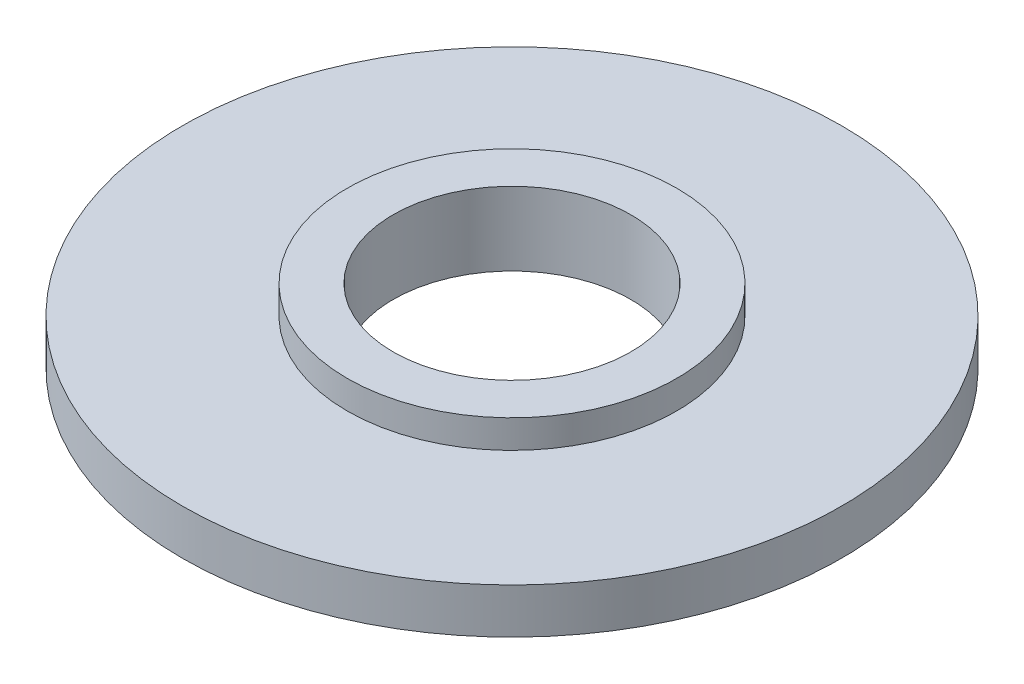
ISO-10303-21;
HEADER;
FILE_DESCRIPTION(('STEP AP214'),'2;1');
FILE_NAME('part.step','',(''),(''),'','','');
FILE_SCHEMA(('AUTOMOTIVE_DESIGN { 1 0 10303 214 1 1 1 1 }'));
ENDSEC;
DATA;
#1=APPLICATION_CONTEXT('core data for automotive mechanical design processes');
#2=APPLICATION_PROTOCOL_DEFINITION('international standard','automotive_design',2000,#1);
#3=PRODUCT_CONTEXT('',#1,'mechanical');
#4=PRODUCT('Part','Part','',(#3));
#5=PRODUCT_RELATED_PRODUCT_CATEGORY('part','',(#4));
#6=PRODUCT_DEFINITION_FORMATION('','',#4);
#7=PRODUCT_DEFINITION_CONTEXT('part definition',#1,'design');
#8=PRODUCT_DEFINITION('design','',#6,#7);
#9=PRODUCT_DEFINITION_SHAPE('','',#8);
#10=(LENGTH_UNIT() NAMED_UNIT(*) SI_UNIT(.MILLI.,.METRE.));
#11=(NAMED_UNIT(*) PLANE_ANGLE_UNIT() SI_UNIT($,.RADIAN.));
#12=(NAMED_UNIT(*) SI_UNIT($,.STERADIAN.) SOLID_ANGLE_UNIT());
#13=UNCERTAINTY_MEASURE_WITH_UNIT(LENGTH_MEASURE(1.E-05),#10,'distance_accuracy_value','');
#14=(GEOMETRIC_REPRESENTATION_CONTEXT(3) GLOBAL_UNCERTAINTY_ASSIGNED_CONTEXT((#13)) GLOBAL_UNIT_ASSIGNED_CONTEXT((#10,
#11,#12)) REPRESENTATION_CONTEXT('',''));
#15=CARTESIAN_POINT('',(0.,0.,0.));
#16=DIRECTION('',(0.,0.,1.));
#17=DIRECTION('',(1.,0.,0.));
#18=AXIS2_PLACEMENT_3D('',#15,#16,#17);
#19=CARTESIAN_POINT('',(0.,1.92,0.));
#20=DIRECTION('',(0.,1.,0.));
#21=DIRECTION('',(0.,0.,1.));
#22=AXIS2_PLACEMENT_3D('',#19,#20,#21);
#23=PLANE('',#22);
#24=CARTESIAN_POINT('',(0.,1.92,0.));
#25=DIRECTION('',(0.,1.,0.));
#26=DIRECTION('',(0.,0.,1.));
#27=AXIS2_PLACEMENT_3D('',#24,#25,#26);
#28=CIRCLE('',#27,14.);
#29=CARTESIAN_POINT('',(0.,1.92,14.));
#30=VERTEX_POINT('',#29);
#31=EDGE_CURVE('E10',#30,#30,#28,.T.);
#32=ORIENTED_EDGE('',*,*,#31,.T.);
#33=EDGE_LOOP('',(#32));
#34=FACE_BOUND('',#33,.T.);
#35=CARTESIAN_POINT('',(0.,1.92,0.));
#36=DIRECTION('',(0.,1.,0.));
#37=DIRECTION('',(0.,0.,1.));
#38=AXIS2_PLACEMENT_3D('',#35,#36,#37);
#39=CIRCLE('',#38,7.);
#40=CARTESIAN_POINT('',(0.,1.92,7.));
#41=VERTEX_POINT('',#40);
#42=EDGE_CURVE('E57',#41,#41,#39,.T.);
#43=ORIENTED_EDGE('',*,*,#42,.F.);
#44=EDGE_LOOP('',(#43));
#45=FACE_BOUND('',#44,.T.);
#46=ADVANCED_FACE('F41',(#34,#45),#23,.T.);
#47=CARTESIAN_POINT('',(0.,0.,0.));
#48=DIRECTION('',(0.,1.,0.));
#49=DIRECTION('',(0.,0.,1.));
#50=AXIS2_PLACEMENT_3D('',#47,#48,#49);
#51=PLANE('',#50);
#52=CARTESIAN_POINT('',(0.,0.,0.));
#53=DIRECTION('',(0.,1.,0.));
#54=DIRECTION('',(0.,0.,1.));
#55=AXIS2_PLACEMENT_3D('',#52,#53,#54);
#56=CIRCLE('',#55,14.);
#57=CARTESIAN_POINT('',(0.,0.,14.));
#58=VERTEX_POINT('',#57);
#59=EDGE_CURVE('E45',#58,#58,#56,.T.);
#60=ORIENTED_EDGE('',*,*,#59,.F.);
#61=EDGE_LOOP('',(#60));
#62=FACE_BOUND('',#61,.T.);
#63=CARTESIAN_POINT('',(0.,0.,0.));
#64=DIRECTION('',(0.,1.,0.));
#65=DIRECTION('',(0.,0.,1.));
#66=AXIS2_PLACEMENT_3D('',#63,#64,#65);
#67=CIRCLE('',#66,5.05);
#68=CARTESIAN_POINT('',(0.,0.,5.05));
#69=VERTEX_POINT('',#68);
#70=EDGE_CURVE('E52',#69,#69,#67,.T.);
#71=ORIENTED_EDGE('',*,*,#70,.T.);
#72=EDGE_LOOP('',(#71));
#73=FACE_BOUND('',#72,.T.);
#74=ADVANCED_FACE('F82',(#62,#73),#51,.F.);
#75=CARTESIAN_POINT('',(0.,1.92,0.));
#76=DIRECTION('',(0.,-1.,0.));
#77=DIRECTION('',(0.,0.,-1.));
#78=AXIS2_PLACEMENT_3D('',#75,#76,#77);
#79=CYLINDRICAL_SURFACE('',#78,14.);
#80=ORIENTED_EDGE('',*,*,#31,.F.);
#81=EDGE_LOOP('',(#80));
#82=FACE_BOUND('',#81,.T.);
#83=ORIENTED_EDGE('',*,*,#59,.T.);
#84=EDGE_LOOP('',(#83));
#85=FACE_BOUND('',#84,.T.);
#86=ADVANCED_FACE('F43',(#82,#85),#79,.T.);
#87=CARTESIAN_POINT('',(0.,1.92,0.));
#88=DIRECTION('',(0.,-1.,0.));
#89=DIRECTION('',(0.,0.,-1.));
#90=AXIS2_PLACEMENT_3D('',#87,#88,#89);
#91=CYLINDRICAL_SURFACE('',#90,5.05);
#92=ORIENTED_EDGE('',*,*,#70,.F.);
#93=EDGE_LOOP('',(#92));
#94=FACE_BOUND('',#93,.T.);
#95=CARTESIAN_POINT('',(0.,3.12,0.));
#96=DIRECTION('',(0.,1.,0.));
#97=DIRECTION('',(0.,0.,1.));
#98=AXIS2_PLACEMENT_3D('',#95,#96,#97);
#99=CIRCLE('',#98,5.05);
#100=CARTESIAN_POINT('',(0.,3.12,5.05));
#101=VERTEX_POINT('',#100);
#102=EDGE_CURVE('E60',#101,#101,#99,.T.);
#103=ORIENTED_EDGE('',*,*,#102,.T.);
#104=EDGE_LOOP('',(#103));
#105=FACE_BOUND('',#104,.T.);
#106=ADVANCED_FACE('F66',(#94,#105),#91,.F.);
#107=CARTESIAN_POINT('',(0.,3.12,0.));
#108=DIRECTION('',(0.,1.,0.));
#109=DIRECTION('',(0.,0.,1.));
#110=AXIS2_PLACEMENT_3D('',#107,#108,#109);
#111=PLANE('',#110);
#112=CARTESIAN_POINT('',(0.,3.12,0.));
#113=DIRECTION('',(0.,1.,0.));
#114=DIRECTION('',(0.,0.,1.));
#115=AXIS2_PLACEMENT_3D('',#112,#113,#114);
#116=CIRCLE('',#115,7.);
#117=CARTESIAN_POINT('',(0.,3.12,7.));
#118=VERTEX_POINT('',#117);
#119=EDGE_CURVE('E56',#118,#118,#116,.T.);
#120=ORIENTED_EDGE('',*,*,#119,.T.);
#121=EDGE_LOOP('',(#120));
#122=FACE_BOUND('',#121,.T.);
#123=ORIENTED_EDGE('',*,*,#102,.F.);
#124=EDGE_LOOP('',(#123));
#125=FACE_BOUND('',#124,.T.);
#126=ADVANCED_FACE('F68',(#122,#125),#111,.T.);
#127=CARTESIAN_POINT('',(0.,3.12,0.));
#128=DIRECTION('',(0.,-1.,0.));
#129=DIRECTION('',(0.,0.,-1.));
#130=AXIS2_PLACEMENT_3D('',#127,#128,#129);
#131=CYLINDRICAL_SURFACE('',#130,7.);
#132=ORIENTED_EDGE('',*,*,#119,.F.);
#133=EDGE_LOOP('',(#132));
#134=FACE_BOUND('',#133,.T.);
#135=ORIENTED_EDGE('',*,*,#42,.T.);
#136=EDGE_LOOP('',(#135));
#137=FACE_BOUND('',#136,.T.);
#138=ADVANCED_FACE('F70',(#134,#137),#131,.T.);
#139=CLOSED_SHELL('',(#46,#74,#86,#106,#126,#138));
#140=MANIFOLD_SOLID_BREP('B2',#139);
#141=ADVANCED_BREP_SHAPE_REPRESENTATION('',(#18,#140),#14);
#142=SHAPE_DEFINITION_REPRESENTATION(#9,#141);
ENDSEC;
END-ISO-10303-21;
